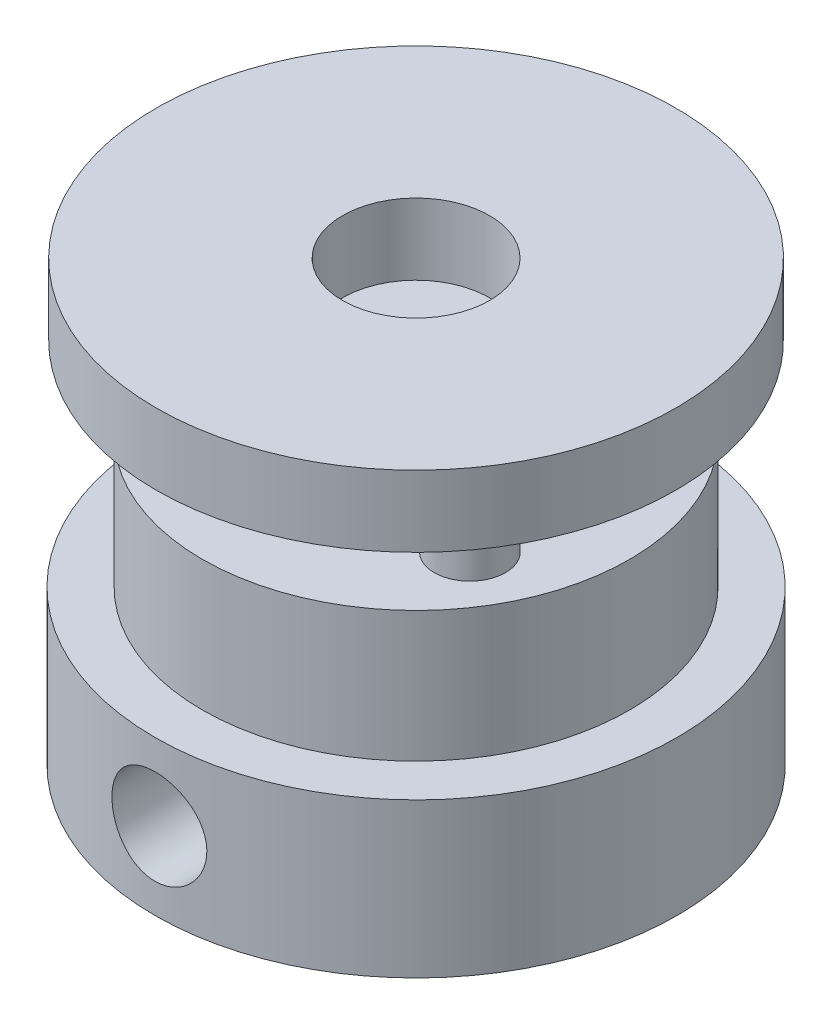
ISO-10303-21;
HEADER;
FILE_DESCRIPTION(('STEP AP214'),'2;1');
FILE_NAME('part.step','',(''),(''),'','','');
FILE_SCHEMA(('AUTOMOTIVE_DESIGN { 1 0 10303 214 1 1 1 1 }'));
ENDSEC;
DATA;
#1=APPLICATION_CONTEXT('core data for automotive mechanical design processes');
#2=APPLICATION_PROTOCOL_DEFINITION('international standard','automotive_design',2000,#1);
#3=PRODUCT_CONTEXT('',#1,'mechanical');
#4=PRODUCT('Part','Part','',(#3));
#5=PRODUCT_RELATED_PRODUCT_CATEGORY('part','',(#4));
#6=PRODUCT_DEFINITION_FORMATION('','',#4);
#7=PRODUCT_DEFINITION_CONTEXT('part definition',#1,'design');
#8=PRODUCT_DEFINITION('design','',#6,#7);
#9=PRODUCT_DEFINITION_SHAPE('','',#8);
#10=(LENGTH_UNIT() NAMED_UNIT(*) SI_UNIT(.MILLI.,.METRE.));
#11=(NAMED_UNIT(*) PLANE_ANGLE_UNIT() SI_UNIT($,.RADIAN.));
#12=(NAMED_UNIT(*) SI_UNIT($,.STERADIAN.) SOLID_ANGLE_UNIT());
#13=UNCERTAINTY_MEASURE_WITH_UNIT(LENGTH_MEASURE(1.E-05),#10,'distance_accuracy_value','');
#14=(GEOMETRIC_REPRESENTATION_CONTEXT(3) GLOBAL_UNCERTAINTY_ASSIGNED_CONTEXT((#13)) GLOBAL_UNIT_ASSIGNED_CONTEXT((#10,
#11,#12)) REPRESENTATION_CONTEXT('',''));
#15=CARTESIAN_POINT('',(0.,0.,0.));
#16=DIRECTION('',(0.,0.,1.));
#17=DIRECTION('',(1.,0.,0.));
#18=AXIS2_PLACEMENT_3D('',#15,#16,#17);
#19=CARTESIAN_POINT('',(0.,6.5,0.));
#20=DIRECTION('',(0.,-1.,0.));
#21=DIRECTION('',(0.,0.,-1.));
#22=AXIS2_PLACEMENT_3D('',#19,#20,#21);
#23=CYLINDRICAL_SURFACE('',#22,11.);
#24=CARTESIAN_POINT('',(0.,6.5,0.));
#25=DIRECTION('',(0.,1.,0.));
#26=DIRECTION('',(0.,0.,1.));
#27=AXIS2_PLACEMENT_3D('',#24,#25,#26);
#28=CIRCLE('',#27,11.);
#29=CARTESIAN_POINT('',(0.,6.5,11.));
#30=VERTEX_POINT('',#29);
#31=EDGE_CURVE('E10',#30,#30,#28,.T.);
#32=ORIENTED_EDGE('',*,*,#31,.F.);
#33=EDGE_LOOP('',(#32));
#34=FACE_BOUND('',#33,.T.);
#35=CARTESIAN_POINT('',(0.,0.,0.));
#36=DIRECTION('',(0.,1.,0.));
#37=DIRECTION('',(0.,0.,1.));
#38=AXIS2_PLACEMENT_3D('',#35,#36,#37);
#39=CIRCLE('',#38,11.);
#40=CARTESIAN_POINT('',(0.,0.,11.));
#41=VERTEX_POINT('',#40);
#42=EDGE_CURVE('E43',#41,#41,#39,.T.);
#43=ORIENTED_EDGE('',*,*,#42,.T.);
#44=EDGE_LOOP('',(#43));
#45=FACE_BOUND('',#44,.T.);
#46=CARTESIAN_POINT('',(0.,1.25,11.));
#47=CARTESIAN_POINT('',(0.111357271644373,1.25000431866068,10.9999980072786));
#48=CARTESIAN_POINT('',(0.222771449918203,1.25933175748265,10.9982915273343));
#49=CARTESIAN_POINT('',(0.442464406848309,1.29637346602492,10.99164847502));
#50=CARTESIAN_POINT('',(0.550740387266074,1.32410364858137,10.9867091072254));
#51=CARTESIAN_POINT('',(0.760947572513748,1.39707712967099,10.9741532323507));
#52=CARTESIAN_POINT('',(0.862884263930176,1.44230503218976,10.9665390793192));
#53=CARTESIAN_POINT('',(1.0577120033845,1.54894733119179,10.949466714983));
#54=CARTESIAN_POINT('',(1.15060386767904,1.61036026518819,10.9400086703132));
#55=CARTESIAN_POINT('',(1.32576444051238,1.74836590964271,10.9201743349983));
#56=CARTESIAN_POINT('',(1.40791622603346,1.82510584198076,10.9097897259708));
#57=CARTESIAN_POINT('',(1.55825357341079,1.99127035408983,10.8893349521181));
#58=CARTESIAN_POINT('',(1.62643816794977,2.08069581168915,10.8792648091126));
#59=CARTESIAN_POINT('',(1.74738695016477,2.27051272945977,10.8604984020977));
#60=CARTESIAN_POINT('',(1.80003313265556,2.37098053523038,10.851812871101));
#61=CARTESIAN_POINT('',(1.88765546949978,2.57951865032397,10.836915832769));
#62=CARTESIAN_POINT('',(1.92263305283275,2.68758834402504,10.8307041253674));
#63=CARTESIAN_POINT('',(1.97355197711315,2.9070146493566,10.8215415351671));
#64=CARTESIAN_POINT('',(1.98969666425445,3.01832259170963,10.8185558462234));
#65=CARTESIAN_POINT('',(2.00312248736688,3.24210440731457,10.8160783143231));
#66=CARTESIAN_POINT('',(2.00040521296643,3.35457818151603,10.8165861769405));
#67=CARTESIAN_POINT('',(1.97634934427,3.57603191413302,10.8210066504918));
#68=CARTESIAN_POINT('',(1.95524117699072,3.68503786789572,10.8248771281426));
#69=CARTESIAN_POINT('',(1.89536523340026,3.89793501836717,10.8355206127391));
#70=CARTESIAN_POINT('',(1.85659674743188,4.00182600935179,10.8422937363232));
#71=CARTESIAN_POINT('',(1.76227297789295,4.20222279077874,10.8580238155272));
#72=CARTESIAN_POINT('',(1.7066239037154,4.29868344266613,10.8669929171435));
#73=CARTESIAN_POINT('',(1.58018503374043,4.48098473694529,10.8860962201172));
#74=CARTESIAN_POINT('',(1.50939379023584,4.56682436264624,10.8962305328347));
#75=CARTESIAN_POINT('',(1.35343399418352,4.72677899644437,10.9167064080854));
#76=CARTESIAN_POINT('',(1.2680681726569,4.80070168843691,10.9270488181647));
#77=CARTESIAN_POINT('',(1.08604454069331,4.93320513348083,10.9466375043709));
#78=CARTESIAN_POINT('',(0.989386629498156,4.99178574962127,10.9558837707156));
#79=CARTESIAN_POINT('',(0.787327598497296,5.09196738978503,10.9722553782534));
#80=CARTESIAN_POINT('',(0.681916780395491,5.13354926869598,10.9793783255922));
#81=CARTESIAN_POINT('',(0.465448414462665,5.1983631924937,10.9906820547088));
#82=CARTESIAN_POINT('',(0.354391431316064,5.22159706857391,10.994863130091));
#83=CARTESIAN_POINT('',(0.131438649578498,5.24878976191912,10.9997719337866));
#84=CARTESIAN_POINT('',(0.0195760121089334,5.25301222345408,11.0005468934114));
#85=CARTESIAN_POINT('',(-0.203257238970968,5.24276820181851,10.998686302475));
#86=CARTESIAN_POINT('',(-0.314227893453082,5.22830257992826,10.9960509090871));
#87=CARTESIAN_POINT('',(-0.531297097592758,5.18131225043812,10.9876950863245));
#88=CARTESIAN_POINT('',(-0.637425297458318,5.14892013081717,10.9819973157216));
#89=CARTESIAN_POINT('',(-0.842744713756611,5.06713917147806,10.9681529512222));
#90=CARTESIAN_POINT('',(-0.941935480960949,5.0177492323023,10.9600061989244));
#91=CARTESIAN_POINT('',(-1.13169524707493,4.90278536219707,10.9420497958484));
#92=CARTESIAN_POINT('',(-1.22216445208488,4.83704931284407,10.932223816146));
#93=CARTESIAN_POINT('',(-1.39088213822347,4.6914796233289,10.9120428807109));
#94=CARTESIAN_POINT('',(-1.46912954974332,4.61164475058806,10.901687878785));
#95=CARTESIAN_POINT('',(-1.6121773788768,4.4389531185515,10.8814603955764));
#96=CARTESIAN_POINT('',(-1.67679836741418,4.34594669347414,10.8715955212189));
#97=CARTESIAN_POINT('',(-1.78949986552014,4.15024381859351,10.8536151008102));
#98=CARTESIAN_POINT('',(-1.83758096630795,4.04754771531562,10.8454994922354));
#99=CARTESIAN_POINT('',(-1.91557945241746,3.83584925030825,10.8319954461548));
#100=CARTESIAN_POINT('',(-1.9455810786184,3.72687876926195,10.8265943801675));
#101=CARTESIAN_POINT('',(-1.98683040178554,3.50533701136893,10.8191012654539));
#102=CARTESIAN_POINT('',(-1.99808007453629,3.39276611515108,10.8170088681136));
#103=CARTESIAN_POINT('',(-2.00144313663184,3.16901462453636,10.8163869388262));
#104=CARTESIAN_POINT('',(-1.99383937001232,3.05783832856146,10.8178047454411));
#105=CARTESIAN_POINT('',(-1.96032846912815,2.83837636198259,10.8239270874703));
#106=CARTESIAN_POINT('',(-1.93442142905718,2.73009067650572,10.8286316059701));
#107=CARTESIAN_POINT('',(-1.86515567158476,2.51962380260463,10.8407757208091));
#108=CARTESIAN_POINT('',(-1.82182581019232,2.41743283977657,10.8482107929975));
#109=CARTESIAN_POINT('',(-1.71897473664823,2.22172555283526,10.8649817751485));
#110=CARTESIAN_POINT('',(-1.65945247569007,2.12820979115441,10.8743178082294));
#111=CARTESIAN_POINT('',(-1.52491543662799,1.95108712540438,10.8940032465147));
#112=CARTESIAN_POINT('',(-1.44969415553099,1.86763843012924,10.9043650783111));
#113=CARTESIAN_POINT('',(-1.28632651423364,1.71445291898781,10.9248399206865));
#114=CARTESIAN_POINT('',(-1.19817718680093,1.64471925960775,10.9349528735191));
#115=CARTESIAN_POINT('',(-1.0105711896463,1.52039970287651,10.9538897429719));
#116=CARTESIAN_POINT('',(-0.911025849790496,1.46594581481987,10.9627021317343));
#117=CARTESIAN_POINT('',(-0.704073905086344,1.37462078392595,10.9779326099335));
#118=CARTESIAN_POINT('',(-0.596674925486669,1.33773284072168,10.9843529858473));
#119=CARTESIAN_POINT('',(-0.407441749458405,1.29022456969781,10.9927407037649));
#120=CARTESIAN_POINT('',(-0.326725427276489,1.27516566703965,10.9954478027358));
#121=CARTESIAN_POINT('',(-0.164016342132202,1.2550519062051,10.9990781643304));
#122=CARTESIAN_POINT('',(-0.0820236084408326,1.24999681895823,11.0000014678));
#123=CARTESIAN_POINT('',(0.,1.25,11.));
#124=B_SPLINE_CURVE_WITH_KNOTS('',3,(#46,#47,#48,#49,#50,#51,#52,#53,#54,#55,#56,#57,#58,#59,
#60,#61,#62,#63,#64,#65,#66,#67,#68,#69,#70,#71,#72,#73,#74,#75,#76,#77,#78,#79,#80,#81,#82,#83,
#84,#85,#86,#87,#88,#89,#90,#91,#92,#93,#94,#95,#96,#97,#98,#99,#100,#101,#102,#103,#104,#105,
#106,#107,#108,#109,#110,#111,#112,#113,#114,#115,#116,#117,#118,#119,#120,#121,#122,#123),
.UNSPECIFIED.,.T.,.F.,(4,2,2,2,2,2,2,2,2,2,2,2,2,2,2,2,2,2,2,2,2,2,2,2,2,2,2,2,2,2,2,2,2,2,2,2,
2,2,4),(0.,0.333771891552332,0.66783277207259,1.00160038286674,1.3353378446015,1.67245014596885,
2.00958578663078,2.3492195220365,2.6888257845573,3.02473021172645,3.36060633024202,
3.69233367290895,4.02407434678871,4.35769306461625,4.69134369321255,5.02993210441872,
5.36852353704646,5.70749527023812,6.04643316861453,6.38065600997364,6.71486344850797,
7.0466314328543,7.37842088074221,7.71364226795666,8.04889297616123,8.38831506130458,
8.72772501252474,9.06554101076157,9.40332141303601,9.73606509730371,10.0688070691931,
10.4010002025896,10.733214857769,11.0701111453004,11.4070848782946,11.7468860454293,
12.0863615649817,12.3322171022956,12.5780670098676),.UNSPECIFIED.);
#125=CARTESIAN_POINT('',(0.,1.25,11.));
#126=VERTEX_POINT('',#125);
#127=EDGE_CURVE('E89',#126,#126,#124,.T.);
#128=ORIENTED_EDGE('',*,*,#127,.F.);
#129=EDGE_LOOP('',(#128));
#130=FACE_BOUND('',#129,.T.);
#131=ADVANCED_FACE('F31',(#34,#45,#130),#23,.T.);
#132=CARTESIAN_POINT('',(0.,0.,0.));
#133=DIRECTION('',(0.,1.,0.));
#134=DIRECTION('',(0.,0.,1.));
#135=AXIS2_PLACEMENT_3D('',#132,#133,#134);
#136=CYLINDRICAL_SURFACE('',#135,3.);
#137=CARTESIAN_POINT('',(0.,0.,0.));
#138=DIRECTION('',(0.,1.,0.));
#139=DIRECTION('',(0.,0.,1.));
#140=AXIS2_PLACEMENT_3D('',#137,#138,#139);
#141=CIRCLE('',#140,3.);
#142=CARTESIAN_POINT('',(0.,0.,3.));
#143=VERTEX_POINT('',#142);
#144=EDGE_CURVE('E53',#143,#143,#141,.T.);
#145=ORIENTED_EDGE('',*,*,#144,.F.);
#146=EDGE_LOOP('',(#145));
#147=FACE_BOUND('',#146,.T.);
#148=CARTESIAN_POINT('',(0.,12.,0.));
#149=DIRECTION('',(0.,1.,0.));
#150=DIRECTION('',(0.,0.,1.));
#151=AXIS2_PLACEMENT_3D('',#148,#149,#150);
#152=CIRCLE('',#151,3.);
#153=CARTESIAN_POINT('',(0.,12.,3.));
#154=VERTEX_POINT('',#153);
#155=EDGE_CURVE('E56',#154,#154,#152,.T.);
#156=ORIENTED_EDGE('',*,*,#155,.T.);
#157=EDGE_LOOP('',(#156));
#158=FACE_BOUND('',#157,.T.);
#159=CARTESIAN_POINT('',(0.,1.25,3.));
#160=CARTESIAN_POINT('',(-0.100484716668078,1.24999945036753,3.0000004164484));
#161=CARTESIAN_POINT('',(-0.200969087132901,1.2576139699555,2.99490802753388));
#162=CARTESIAN_POINT('',(-0.398733058031681,1.28759686410566,2.97504652423809));
#163=CARTESIAN_POINT('',(-0.496011113955007,1.30997224312329,2.96027281581235));
#164=CARTESIAN_POINT('',(-0.684212307854249,1.36810771732484,2.92250482404708));
#165=CARTESIAN_POINT('',(-0.775162872657554,1.40380514000794,2.89954905493315));
#166=CARTESIAN_POINT('',(-0.94941529099726,1.4870633632715,2.8472613787744));
#167=CARTESIAN_POINT('',(-1.03271603160967,1.53462588630056,2.8179285460551));
#168=CARTESIAN_POINT('',(-1.19728470077011,1.64465693736743,2.75227329369838));
#169=CARTESIAN_POINT('',(-1.27778030546067,1.70804786074289,2.71556897579319));
#170=CARTESIAN_POINT('',(-1.42772804469274,1.84573004865845,2.63982313083466));
#171=CARTESIAN_POINT('',(-1.49716405543888,1.92003692983774,2.60077830356832));
#172=CARTESIAN_POINT('',(-1.63422297745496,2.09105236761267,2.51728264678794));
#173=CARTESIAN_POINT('',(-1.6998318636275,2.18944565320345,2.47295067937795));
#174=CARTESIAN_POINT('',(-1.81350357014175,2.39836337764653,2.3908414735282));
#175=CARTESIAN_POINT('',(-1.86159673426503,2.50886640156274,2.35305295954668));
#176=CARTESIAN_POINT('',(-1.92674035011438,2.70671129342162,2.2997626664146));
#177=CARTESIAN_POINT('',(-1.94874447236008,2.79152845287391,2.28097627892403));
#178=CARTESIAN_POINT('',(-1.98150617785228,2.96474450474165,2.25257969659604));
#179=CARTESIAN_POINT('',(-1.99228314651963,3.05313694872606,2.24295368744147));
#180=CARTESIAN_POINT('',(-2.00191364141227,3.23147477885647,2.23436605608045));
#181=CARTESIAN_POINT('',(-2.00071842917524,3.3214250234524,2.23544802558502));
#182=CARTESIAN_POINT('',(-1.98637581333356,3.49963497349975,2.24819775483425));
#183=CARTESIAN_POINT('',(-1.97321828380393,3.58789318202813,2.25987448286881));
#184=CARTESIAN_POINT('',(-1.93664994217326,3.75646705124188,2.29127185989959));
#185=CARTESIAN_POINT('',(-1.91371711479477,3.83696133593877,2.31061488324375));
#186=CARTESIAN_POINT('',(-1.85870118583424,3.99302369097578,2.35509622933623));
#187=CARTESIAN_POINT('',(-1.8266150732855,4.06859013023865,2.3802364585489));
#188=CARTESIAN_POINT('',(-1.74673818732648,4.22902539535644,2.43964196377947));
#189=CARTESIAN_POINT('',(-1.69708052300445,4.31265990048309,2.47472317740626));
#190=CARTESIAN_POINT('',(-1.58668960438221,4.47138339528575,2.54691537733438));
#191=CARTESIAN_POINT('',(-1.52594268999614,4.54646165776207,2.58402882709328));
#192=CARTESIAN_POINT('',(-1.37981165322309,4.70254254560342,2.66543343763724));
#193=CARTESIAN_POINT('',(-1.29193938283656,4.78133404868276,2.7095474472056));
#194=CARTESIAN_POINT('',(-1.10200799908008,4.92319649453848,2.79218100665211));
#195=CARTESIAN_POINT('',(-0.999962299343698,4.98628214540898,2.83070577648042));
#196=CARTESIAN_POINT('',(-0.804857827096532,5.08347771862287,2.89145404090364));
#197=CARTESIAN_POINT('',(-0.713957643371912,5.12084336333894,2.9153926116554));
#198=CARTESIAN_POINT('',(-0.526036043935483,5.18210492562537,2.95507719030499));
#199=CARTESIAN_POINT('',(-0.429019879001652,5.20601222713222,2.97083012127543));
#200=CARTESIAN_POINT('',(-0.230985453172283,5.239161165238,2.99275882156808));
#201=CARTESIAN_POINT('',(-0.12995181193416,5.24833946093826,2.99889322461187));
#202=CARTESIAN_POINT('',(0.0724415193893446,5.25124708856221,3.00083114965147));
#203=CARTESIAN_POINT('',(0.173801186186623,5.24497750048877,2.99663539385634));
#204=CARTESIAN_POINT('',(0.366455717204237,5.21837594443805,2.97899589424273));
#205=CARTESIAN_POINT('',(0.457957444679192,5.19906270224478,2.96622246390226));
#206=CARTESIAN_POINT('',(0.636116392427399,5.14840431398714,2.93318449284837));
#207=CARTESIAN_POINT('',(0.722772837571132,5.11705724907179,2.91291875746989));
#208=CARTESIAN_POINT('',(0.894664750465995,5.04134770295508,2.86496352529158));
#209=CARTESIAN_POINT('',(0.979496184631417,4.99631184591814,2.83689870135785));
#210=CARTESIAN_POINT('',(1.14068302395729,4.89556671005373,2.77601855611511));
#211=CARTESIAN_POINT('',(1.21703314820091,4.83985083946783,2.74320030403941));
#212=CARTESIAN_POINT('',(1.37185445482324,4.70939213184249,2.6695454665343));
#213=CARTESIAN_POINT('',(1.44875187569565,4.63303373992491,2.62826156800165));
#214=CARTESIAN_POINT('',(1.58933968069449,4.46888857004289,2.54571173085958));
#215=CARTESIAN_POINT('',(1.6530209365723,4.3810939608925,2.50444582417845));
#216=CARTESIAN_POINT('',(1.76124776549313,4.20285758723188,2.4293967897058));
#217=CARTESIAN_POINT('',(1.80695636125283,4.11326796653779,2.39527597025701));
#218=CARTESIAN_POINT('',(1.88496213740264,3.92612734755637,2.33438974266155));
#219=CARTESIAN_POINT('',(1.91728345682189,3.82859106169538,2.30761112529822));
#220=CARTESIAN_POINT('',(1.9623584346534,3.64543551280459,2.26933208182633));
#221=CARTESIAN_POINT('',(1.97758597566225,3.56082819012399,2.25594998021257));
#222=CARTESIAN_POINT('',(1.99699205923373,3.38942671868162,2.23879466438398));
#223=CARTESIAN_POINT('',(2.00118260285317,3.3026350488605,2.23501101347816));
#224=CARTESIAN_POINT('',(1.99823921981266,3.1293569432763,2.23764201149981));
#225=CARTESIAN_POINT('',(1.99109858767783,3.04287071862624,2.24406269907463));
#226=CARTESIAN_POINT('',(1.96596997224746,2.87265647146788,2.26610452403491));
#227=CARTESIAN_POINT('',(1.94796751728258,2.78893228617568,2.28173793527615));
#228=CARTESIAN_POINT('',(1.89593035657494,2.60428881351877,2.32526843904801));
#229=CARTESIAN_POINT('',(1.85890187130765,2.50473228705668,2.35532333574983));
#230=CARTESIAN_POINT('',(1.77084526236221,2.3145131656158,2.42222161121309));
#231=CARTESIAN_POINT('',(1.71979748341259,2.22386330200831,2.459074496867));
#232=CARTESIAN_POINT('',(1.60398280555153,2.05071811286377,2.53617186577119));
#233=CARTESIAN_POINT('',(1.53898309894021,1.96840125457695,2.5764658739228));
#234=CARTESIAN_POINT('',(1.39671768031094,1.81467752174207,2.65628301537844));
#235=CARTESIAN_POINT('',(1.31944821025749,1.74327400297079,2.69580590832396));
#236=CARTESIAN_POINT('',(1.14145732976974,1.60328789569092,2.77631551964082));
#237=CARTESIAN_POINT('',(1.03896166955575,1.53658135982168,2.81669805449991));
#238=CARTESIAN_POINT('',(0.820868555771216,1.4220867233347,2.88777665874161));
#239=CARTESIAN_POINT('',(0.705292062449157,1.37426889317605,2.91848793445255));
#240=CARTESIAN_POINT('',(0.491435069835746,1.30884542183622,2.96101644836895));
#241=CARTESIAN_POINT('',(0.395012325257921,1.28688896090138,2.97551480368935));
#242=CARTESIAN_POINT('',(0.199058012023945,1.2574719674619,2.99500280141853));
#243=CARTESIAN_POINT('',(0.0995288361880075,1.25000054440399,2.99999958751315));
#244=CARTESIAN_POINT('',(0.,1.25,3.));
#245=B_SPLINE_CURVE_WITH_KNOTS('',3,(#159,#160,#161,#162,#163,#164,#165,#166,#167,#168,#169,
#170,#171,#172,#173,#174,#175,#176,#177,#178,#179,#180,#181,#182,#183,#184,#185,#186,#187,#188,
#189,#190,#191,#192,#193,#194,#195,#196,#197,#198,#199,#200,#201,#202,#203,#204,#205,#206,#207,
#208,#209,#210,#211,#212,#213,#214,#215,#216,#217,#218,#219,#220,#221,#222,#223,#224,#225,#226,
#227,#228,#229,#230,#231,#232,#233,#234,#235,#236,#237,#238,#239,#240,#241,#242,#243,#244),
.UNSPECIFIED.,.T.,.F.,(4,2,2,2,2,2,2,2,2,2,2,2,2,2,2,2,2,2,2,2,2,2,2,2,2,2,2,2,2,2,2,2,2,2,2,2,
2,2,2,2,2,2,4),(0.,0.3010532265054,0.602249414348688,0.902046153190232,1.20188643867386,
1.52717029000557,1.85292411604319,2.23006683295982,2.60655305445439,2.87433693676029,
3.14165767845809,3.41006711735378,3.67870397263352,3.93548862198022,4.19235783805078,
4.50147574660873,4.81097703780057,5.18718954496752,5.56304840301362,5.86524087696758,
6.16717735142813,6.4704088329425,6.77361911533414,7.05553084792472,7.3374875513827,
7.63652346829516,7.93574454945203,8.28228176141291,8.62905753175757,8.94649935304476,
9.26336626640722,9.52324048016134,9.78283200333091,10.0425772028455,10.302669238524,
10.6320660870419,10.9619271337795,11.2977924520448,11.6337608397015,12.0179535155883,
12.4015390656083,12.6999529136674,12.9981423125957),.UNSPECIFIED.);
#246=CARTESIAN_POINT('',(0.,1.25,3.));
#247=VERTEX_POINT('',#246);
#248=EDGE_CURVE('E35',#247,#247,#245,.T.);
#249=ORIENTED_EDGE('',*,*,#248,.F.);
#250=EDGE_LOOP('',(#249));
#251=FACE_BOUND('',#250,.T.);
#252=ADVANCED_FACE('F129',(#147,#158,#251),#136,.F.);
#253=CARTESIAN_POINT('',(0.,6.5,0.));
#254=DIRECTION('',(0.,1.,0.));
#255=DIRECTION('',(0.,0.,1.));
#256=AXIS2_PLACEMENT_3D('',#253,#254,#255);
#257=PLANE('',#256);
#258=CARTESIAN_POINT('',(0.,6.5,0.));
#259=DIRECTION('',(0.,1.,0.));
#260=DIRECTION('',(0.,0.,1.));
#261=AXIS2_PLACEMENT_3D('',#258,#259,#260);
#262=CIRCLE('',#261,9.);
#263=CARTESIAN_POINT('',(0.,6.5,9.));
#264=VERTEX_POINT('',#263);
#265=EDGE_CURVE('E50',#264,#264,#262,.T.);
#266=ORIENTED_EDGE('',*,*,#265,.F.);
#267=EDGE_LOOP('',(#266));
#268=FACE_BOUND('',#267,.T.);
#269=ORIENTED_EDGE('',*,*,#31,.T.);
#270=EDGE_LOOP('',(#269));
#271=FACE_BOUND('',#270,.T.);
#272=ADVANCED_FACE('F133',(#268,#271),#257,.T.);
#273=CARTESIAN_POINT('',(0.,0.,0.));
#274=DIRECTION('',(0.,1.,0.));
#275=DIRECTION('',(0.,0.,1.));
#276=AXIS2_PLACEMENT_3D('',#273,#274,#275);
#277=PLANE('',#276);
#278=ORIENTED_EDGE('',*,*,#144,.T.);
#279=EDGE_LOOP('',(#278));
#280=FACE_BOUND('',#279,.T.);
#281=ORIENTED_EDGE('',*,*,#42,.F.);
#282=EDGE_LOOP('',(#281));
#283=FACE_BOUND('',#282,.T.);
#284=ADVANCED_FACE('F141',(#280,#283),#277,.F.);
#285=CARTESIAN_POINT('',(0.,12.,0.));
#286=DIRECTION('',(0.,-1.,0.));
#287=DIRECTION('',(0.,0.,-1.));
#288=AXIS2_PLACEMENT_3D('',#285,#286,#287);
#289=CYLINDRICAL_SURFACE('',#288,9.);
#290=CARTESIAN_POINT('',(0.,12.,0.));
#291=DIRECTION('',(0.,1.,0.));
#292=DIRECTION('',(0.,0.,1.));
#293=AXIS2_PLACEMENT_3D('',#290,#291,#292);
#294=CIRCLE('',#293,9.);
#295=CARTESIAN_POINT('',(0.,12.,9.));
#296=VERTEX_POINT('',#295);
#297=EDGE_CURVE('E48',#296,#296,#294,.T.);
#298=ORIENTED_EDGE('',*,*,#297,.F.);
#299=EDGE_LOOP('',(#298));
#300=FACE_BOUND('',#299,.T.);
#301=ORIENTED_EDGE('',*,*,#265,.T.);
#302=EDGE_LOOP('',(#301));
#303=FACE_BOUND('',#302,.T.);
#304=ADVANCED_FACE('F137',(#300,#303),#289,.T.);
#305=CARTESIAN_POINT('',(0.,12.,0.));
#306=DIRECTION('',(0.,1.,0.));
#307=DIRECTION('',(0.,0.,1.));
#308=AXIS2_PLACEMENT_3D('',#305,#306,#307);
#309=PLANE('',#308);
#310=CARTESIAN_POINT('',(5.36935750346355,12.,3.09999999999995));
#311=DIRECTION('',(0.,1.,0.));
#312=DIRECTION('',(-0.866025403784443,0.,-0.499999999999992));
#313=AXIS2_PLACEMENT_3D('',#310,#311,#312);
#314=CIRCLE('',#313,1.5);
#315=CARTESIAN_POINT('',(4.07031939778688,12.,2.34999999999996));
#316=VERTEX_POINT('',#315);
#317=EDGE_CURVE('E74',#316,#316,#314,.T.);
#318=ORIENTED_EDGE('',*,*,#317,.F.);
#319=EDGE_LOOP('',(#318));
#320=FACE_BOUND('',#319,.T.);
#321=CARTESIAN_POINT('',(-5.36935750346351,12.,3.10000000000003));
#322=DIRECTION('',(0.,1.,0.));
#323=DIRECTION('',(0.866025403784436,0.,-0.500000000000004));
#324=AXIS2_PLACEMENT_3D('',#321,#322,#323);
#325=CIRCLE('',#324,1.5);
#326=CARTESIAN_POINT('',(-4.07031939778685,12.,2.35000000000002));
#327=VERTEX_POINT('',#326);
#328=EDGE_CURVE('E68',#327,#327,#325,.T.);
#329=ORIENTED_EDGE('',*,*,#328,.F.);
#330=EDGE_LOOP('',(#329));
#331=FACE_BOUND('',#330,.T.);
#332=CARTESIAN_POINT('',(0.,12.,-6.2));
#333=DIRECTION('',(0.,1.,0.));
#334=DIRECTION('',(0.,0.,1.));
#335=AXIS2_PLACEMENT_3D('',#332,#333,#334);
#336=CIRCLE('',#335,1.5);
#337=CARTESIAN_POINT('',(0.,12.,-4.7));
#338=VERTEX_POINT('',#337);
#339=EDGE_CURVE('E62',#338,#338,#336,.T.);
#340=ORIENTED_EDGE('',*,*,#339,.F.);
#341=EDGE_LOOP('',(#340));
#342=FACE_BOUND('',#341,.T.);
#343=ORIENTED_EDGE('',*,*,#155,.F.);
#344=EDGE_LOOP('',(#343));
#345=FACE_BOUND('',#344,.T.);
#346=ORIENTED_EDGE('',*,*,#297,.T.);
#347=EDGE_LOOP('',(#346));
#348=FACE_BOUND('',#347,.T.);
#349=ADVANCED_FACE('F127',(#320,#331,#342,#345,#348),#309,.T.);
#350=CARTESIAN_POINT('',(0.,15.5,-6.2));
#351=DIRECTION('',(0.,-1.,0.));
#352=DIRECTION('',(0.,0.,-1.));
#353=AXIS2_PLACEMENT_3D('',#350,#351,#352);
#354=CYLINDRICAL_SURFACE('',#353,1.5);
#355=CARTESIAN_POINT('',(0.,15.5,-6.2));
#356=DIRECTION('',(0.,1.,0.));
#357=DIRECTION('',(0.,0.,1.));
#358=AXIS2_PLACEMENT_3D('',#355,#356,#357);
#359=CIRCLE('',#358,1.5);
#360=CARTESIAN_POINT('',(0.,15.5,-4.7));
#361=VERTEX_POINT('',#360);
#362=EDGE_CURVE('E59',#361,#361,#359,.T.);
#363=ORIENTED_EDGE('',*,*,#362,.F.);
#364=EDGE_LOOP('',(#363));
#365=FACE_BOUND('',#364,.T.);
#366=ORIENTED_EDGE('',*,*,#339,.T.);
#367=EDGE_LOOP('',(#366));
#368=FACE_BOUND('',#367,.T.);
#369=ADVANCED_FACE('F124',(#365,#368),#354,.T.);
#370=CARTESIAN_POINT('',(-5.36935750346351,15.5,3.10000000000003));
#371=DIRECTION('',(0.,-1.,0.));
#372=DIRECTION('',(0.,0.,-1.));
#373=AXIS2_PLACEMENT_3D('',#370,#371,#372);
#374=CYLINDRICAL_SURFACE('',#373,1.5);
#375=CARTESIAN_POINT('',(-5.36935750346351,15.5,3.10000000000003));
#376=DIRECTION('',(0.,1.,0.));
#377=DIRECTION('',(0.866025403784436,0.,-0.500000000000004));
#378=AXIS2_PLACEMENT_3D('',#375,#376,#377);
#379=CIRCLE('',#378,1.5);
#380=CARTESIAN_POINT('',(-4.07031939778685,15.5,2.35000000000002));
#381=VERTEX_POINT('',#380);
#382=EDGE_CURVE('E65',#381,#381,#379,.T.);
#383=ORIENTED_EDGE('',*,*,#382,.F.);
#384=EDGE_LOOP('',(#383));
#385=FACE_BOUND('',#384,.T.);
#386=ORIENTED_EDGE('',*,*,#328,.T.);
#387=EDGE_LOOP('',(#386));
#388=FACE_BOUND('',#387,.T.);
#389=ADVANCED_FACE('F120',(#385,#388),#374,.T.);
#390=CARTESIAN_POINT('',(5.36935750346355,15.5,3.09999999999995));
#391=DIRECTION('',(0.,-1.,0.));
#392=DIRECTION('',(0.,0.,-1.));
#393=AXIS2_PLACEMENT_3D('',#390,#391,#392);
#394=CYLINDRICAL_SURFACE('',#393,1.5);
#395=CARTESIAN_POINT('',(5.36935750346355,15.5,3.09999999999995));
#396=DIRECTION('',(0.,1.,0.));
#397=DIRECTION('',(-0.866025403784443,0.,-0.499999999999992));
#398=AXIS2_PLACEMENT_3D('',#395,#396,#397);
#399=CIRCLE('',#398,1.5);
#400=CARTESIAN_POINT('',(4.07031939778688,15.5,2.34999999999996));
#401=VERTEX_POINT('',#400);
#402=EDGE_CURVE('E71',#401,#401,#399,.T.);
#403=ORIENTED_EDGE('',*,*,#402,.F.);
#404=EDGE_LOOP('',(#403));
#405=FACE_BOUND('',#404,.T.);
#406=ORIENTED_EDGE('',*,*,#317,.T.);
#407=EDGE_LOOP('',(#406));
#408=FACE_BOUND('',#407,.T.);
#409=ADVANCED_FACE('F110',(#405,#408),#394,.T.);
#410=CARTESIAN_POINT('',(0.,18.5,0.));
#411=DIRECTION('',(0.,1.,0.));
#412=DIRECTION('',(0.,0.,1.));
#413=AXIS2_PLACEMENT_3D('',#410,#411,#412);
#414=PLANE('',#413);
#415=CARTESIAN_POINT('',(0.,18.5,0.));
#416=DIRECTION('',(0.,1.,0.));
#417=DIRECTION('',(0.,0.,1.));
#418=AXIS2_PLACEMENT_3D('',#415,#416,#417);
#419=CIRCLE('',#418,10.95);
#420=CARTESIAN_POINT('',(0.,18.5,10.95));
#421=VERTEX_POINT('',#420);
#422=EDGE_CURVE('E77',#421,#421,#419,.T.);
#423=ORIENTED_EDGE('',*,*,#422,.T.);
#424=EDGE_LOOP('',(#423));
#425=FACE_BOUND('',#424,.T.);
#426=CARTESIAN_POINT('',(0.,18.5,0.));
#427=DIRECTION('',(0.,1.,0.));
#428=DIRECTION('',(0.,0.,1.));
#429=AXIS2_PLACEMENT_3D('',#426,#427,#428);
#430=CIRCLE('',#429,3.1);
#431=CARTESIAN_POINT('',(0.,18.5,3.1));
#432=VERTEX_POINT('',#431);
#433=EDGE_CURVE('E83',#432,#432,#430,.T.);
#434=ORIENTED_EDGE('',*,*,#433,.F.);
#435=EDGE_LOOP('',(#434));
#436=FACE_BOUND('',#435,.T.);
#437=ADVANCED_FACE('F106',(#425,#436),#414,.T.);
#438=CARTESIAN_POINT('',(0.,15.5,0.));
#439=DIRECTION('',(0.,1.,0.));
#440=DIRECTION('',(0.,0.,1.));
#441=AXIS2_PLACEMENT_3D('',#438,#439,#440);
#442=PLANE('',#441);
#443=ORIENTED_EDGE('',*,*,#362,.T.);
#444=EDGE_LOOP('',(#443));
#445=FACE_BOUND('',#444,.T.);
#446=ORIENTED_EDGE('',*,*,#382,.T.);
#447=EDGE_LOOP('',(#446));
#448=FACE_BOUND('',#447,.T.);
#449=ORIENTED_EDGE('',*,*,#402,.T.);
#450=EDGE_LOOP('',(#449));
#451=FACE_BOUND('',#450,.T.);
#452=CARTESIAN_POINT('',(0.,15.5,0.));
#453=DIRECTION('',(0.,1.,0.));
#454=DIRECTION('',(0.,0.,1.));
#455=AXIS2_PLACEMENT_3D('',#452,#453,#454);
#456=CIRCLE('',#455,10.95);
#457=CARTESIAN_POINT('',(0.,15.5,10.95));
#458=VERTEX_POINT('',#457);
#459=EDGE_CURVE('E80',#458,#458,#456,.T.);
#460=ORIENTED_EDGE('',*,*,#459,.F.);
#461=EDGE_LOOP('',(#460));
#462=FACE_BOUND('',#461,.T.);
#463=CARTESIAN_POINT('',(0.,15.5,0.));
#464=DIRECTION('',(0.,1.,0.));
#465=DIRECTION('',(0.,0.,1.));
#466=AXIS2_PLACEMENT_3D('',#463,#464,#465);
#467=CIRCLE('',#466,3.1);
#468=CARTESIAN_POINT('',(0.,15.5,3.1));
#469=VERTEX_POINT('',#468);
#470=EDGE_CURVE('E86',#469,#469,#467,.T.);
#471=ORIENTED_EDGE('',*,*,#470,.T.);
#472=EDGE_LOOP('',(#471));
#473=FACE_BOUND('',#472,.T.);
#474=ADVANCED_FACE('F109',(#445,#448,#451,#462,#473),#442,.F.);
#475=CARTESIAN_POINT('',(0.,18.5,0.));
#476=DIRECTION('',(0.,-1.,0.));
#477=DIRECTION('',(0.,0.,-1.));
#478=AXIS2_PLACEMENT_3D('',#475,#476,#477);
#479=CYLINDRICAL_SURFACE('',#478,10.95);
#480=ORIENTED_EDGE('',*,*,#422,.F.);
#481=EDGE_LOOP('',(#480));
#482=FACE_BOUND('',#481,.T.);
#483=ORIENTED_EDGE('',*,*,#459,.T.);
#484=EDGE_LOOP('',(#483));
#485=FACE_BOUND('',#484,.T.);
#486=ADVANCED_FACE('F104',(#482,#485),#479,.T.);
#487=CARTESIAN_POINT('',(0.,18.5,0.));
#488=DIRECTION('',(0.,-1.,0.));
#489=DIRECTION('',(0.,0.,-1.));
#490=AXIS2_PLACEMENT_3D('',#487,#488,#489);
#491=CYLINDRICAL_SURFACE('',#490,3.1);
#492=ORIENTED_EDGE('',*,*,#433,.T.);
#493=EDGE_LOOP('',(#492));
#494=FACE_BOUND('',#493,.T.);
#495=ORIENTED_EDGE('',*,*,#470,.F.);
#496=EDGE_LOOP('',(#495));
#497=FACE_BOUND('',#496,.T.);
#498=ADVANCED_FACE('F99',(#494,#497),#491,.F.);
#499=CARTESIAN_POINT('',(0.,3.25,11.));
#500=DIRECTION('',(0.,0.,-1.));
#501=DIRECTION('',(-1.,0.,0.));
#502=AXIS2_PLACEMENT_3D('',#499,#500,#501);
#503=CYLINDRICAL_SURFACE('',#502,2.);
#504=ORIENTED_EDGE('',*,*,#248,.T.);
#505=EDGE_LOOP('',(#504));
#506=FACE_BOUND('',#505,.T.);
#507=ORIENTED_EDGE('',*,*,#127,.T.);
#508=EDGE_LOOP('',(#507));
#509=FACE_BOUND('',#508,.T.);
#510=ADVANCED_FACE('F95',(#506,#509),#503,.F.);
#511=CLOSED_SHELL('',(#131,#252,#272,#284,#304,#349,#369,#389,#409,#437,#474,#486,#498,#510));
#512=MANIFOLD_SOLID_BREP('B2',#511);
#513=ADVANCED_BREP_SHAPE_REPRESENTATION('',(#18,#512),#14);
#514=SHAPE_DEFINITION_REPRESENTATION(#9,#513);
ENDSEC;
END-ISO-10303-21;
